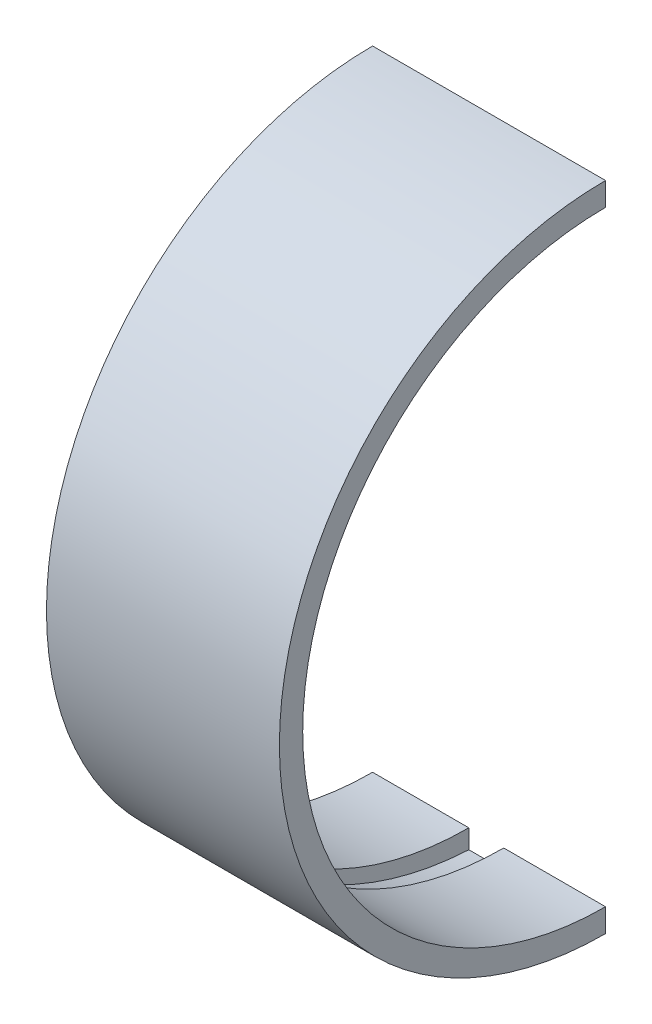
ISO-10303-21;
HEADER;
FILE_DESCRIPTION(('STEP AP214'),'2;1');
FILE_NAME('part.step','',(''),(''),'','','');
FILE_SCHEMA(('AUTOMOTIVE_DESIGN { 1 0 10303 214 1 1 1 1 }'));
ENDSEC;
DATA;
#1=APPLICATION_CONTEXT('core data for automotive mechanical design processes');
#2=APPLICATION_PROTOCOL_DEFINITION('international standard','automotive_design',2000,#1);
#3=PRODUCT_CONTEXT('',#1,'mechanical');
#4=PRODUCT('Part','Part','',(#3));
#5=PRODUCT_RELATED_PRODUCT_CATEGORY('part','',(#4));
#6=PRODUCT_DEFINITION_FORMATION('','',#4);
#7=PRODUCT_DEFINITION_CONTEXT('part definition',#1,'design');
#8=PRODUCT_DEFINITION('design','',#6,#7);
#9=PRODUCT_DEFINITION_SHAPE('','',#8);
#10=(LENGTH_UNIT() NAMED_UNIT(*) SI_UNIT(.MILLI.,.METRE.));
#11=(NAMED_UNIT(*) PLANE_ANGLE_UNIT() SI_UNIT($,.RADIAN.));
#12=(NAMED_UNIT(*) SI_UNIT($,.STERADIAN.) SOLID_ANGLE_UNIT());
#13=UNCERTAINTY_MEASURE_WITH_UNIT(LENGTH_MEASURE(1.E-05),#10,'distance_accuracy_value','');
#14=(GEOMETRIC_REPRESENTATION_CONTEXT(3) GLOBAL_UNCERTAINTY_ASSIGNED_CONTEXT((#13)) GLOBAL_UNIT_ASSIGNED_CONTEXT((#10,
#11,#12)) REPRESENTATION_CONTEXT('',''));
#15=CARTESIAN_POINT('',(0.,0.,0.));
#16=DIRECTION('',(0.,0.,1.));
#17=DIRECTION('',(1.,0.,0.));
#18=AXIS2_PLACEMENT_3D('',#15,#16,#17);
#19=CARTESIAN_POINT('',(508.,0.,0.));
#20=DIRECTION('',(-1.,0.,0.));
#21=DIRECTION('',(0.,0.,1.));
#22=AXIS2_PLACEMENT_3D('',#19,#20,#21);
#23=CYLINDRICAL_SURFACE('',#22,660.4);
#24=DIRECTION('',(-1.,0.,0.));
#25=VECTOR('',#24,1.);
#26=CARTESIAN_POINT('',(508.,660.4,0.));
#27=LINE('',#26,#25);
#28=CARTESIAN_POINT('',(209.868015847257,660.4,0.));
#29=VERTEX_POINT('',#28);
#30=CARTESIAN_POINT('',(0.,660.4,0.));
#31=VERTEX_POINT('',#30);
#32=EDGE_CURVE('E132',#29,#31,#27,.T.);
#33=ORIENTED_EDGE('',*,*,#32,.F.);
#34=CARTESIAN_POINT('',(209.868015847257,0.,0.));
#35=DIRECTION('',(1.,0.,0.));
#36=DIRECTION('',(0.,0.,-1.));
#37=AXIS2_PLACEMENT_3D('',#34,#35,#36);
#38=CIRCLE('',#37,660.4);
#39=CARTESIAN_POINT('',(209.868015847257,-660.4,-6.91732282851602E-12));
#40=VERTEX_POINT('',#39);
#41=EDGE_CURVE('E48',#29,#40,#38,.T.);
#42=ORIENTED_EDGE('',*,*,#41,.T.);
#43=DIRECTION('',(-1.,0.,0.));
#44=VECTOR('',#43,1.);
#45=CARTESIAN_POINT('',(508.,-660.4,-6.91732282851602E-12));
#46=LINE('',#45,#44);
#47=CARTESIAN_POINT('',(0.,-660.4,-6.91732282851602E-12));
#48=VERTEX_POINT('',#47);
#49=EDGE_CURVE('E129',#40,#48,#46,.T.);
#50=ORIENTED_EDGE('',*,*,#49,.T.);
#51=CARTESIAN_POINT('',(0.,0.,0.));
#52=DIRECTION('',(1.,0.,0.));
#53=DIRECTION('',(0.,0.,-1.));
#54=AXIS2_PLACEMENT_3D('',#51,#52,#53);
#55=CIRCLE('',#54,660.4);
#56=EDGE_CURVE('E138',#31,#48,#55,.T.);
#57=ORIENTED_EDGE('',*,*,#56,.F.);
#58=EDGE_LOOP('',(#33,#42,#50,#57));
#59=FACE_BOUND('',#58,.T.);
#60=ADVANCED_FACE('F33',(#59),#23,.F.);
#61=CARTESIAN_POINT('',(508.,0.,0.));
#62=DIRECTION('',(-1.,0.,0.));
#63=DIRECTION('',(0.,0.,1.));
#64=AXIS2_PLACEMENT_3D('',#61,#62,#63);
#65=CYLINDRICAL_SURFACE('',#64,711.2);
#66=CARTESIAN_POINT('',(0.,0.,0.));
#67=DIRECTION('',(1.,0.,0.));
#68=DIRECTION('',(0.,0.,-1.));
#69=AXIS2_PLACEMENT_3D('',#66,#67,#68);
#70=CIRCLE('',#69,711.2);
#71=CARTESIAN_POINT('',(0.,711.2,0.));
#72=VERTEX_POINT('',#71);
#73=CARTESIAN_POINT('',(0.,-711.2,-7.44942458455571E-12));
#74=VERTEX_POINT('',#73);
#75=EDGE_CURVE('E144',#72,#74,#70,.T.);
#76=ORIENTED_EDGE('',*,*,#75,.T.);
#77=DIRECTION('',(-1.,0.,0.));
#78=VECTOR('',#77,1.);
#79=CARTESIAN_POINT('',(508.,-711.2,-7.44942458455571E-12));
#80=LINE('',#79,#78);
#81=CARTESIAN_POINT('',(508.,-711.2,-7.44942458455571E-12));
#82=VERTEX_POINT('',#81);
#83=EDGE_CURVE('E111',#82,#74,#80,.T.);
#84=ORIENTED_EDGE('',*,*,#83,.F.);
#85=CARTESIAN_POINT('',(508.,0.,0.));
#86=DIRECTION('',(1.,0.,0.));
#87=DIRECTION('',(0.,0.,-1.));
#88=AXIS2_PLACEMENT_3D('',#85,#86,#87);
#89=CIRCLE('',#88,711.2);
#90=CARTESIAN_POINT('',(508.,711.2,0.));
#91=VERTEX_POINT('',#90);
#92=EDGE_CURVE('E83',#91,#82,#89,.T.);
#93=ORIENTED_EDGE('',*,*,#92,.F.);
#94=DIRECTION('',(-1.,0.,0.));
#95=VECTOR('',#94,1.);
#96=CARTESIAN_POINT('',(508.,711.2,0.));
#97=LINE('',#96,#95);
#98=EDGE_CURVE('E57',#91,#72,#97,.T.);
#99=ORIENTED_EDGE('',*,*,#98,.T.);
#100=EDGE_LOOP('',(#76,#84,#93,#99));
#101=FACE_BOUND('',#100,.T.);
#102=ADVANCED_FACE('F35',(#101),#65,.T.);
#103=CARTESIAN_POINT('',(508.,-660.4,-6.91732282851602E-12));
#104=DIRECTION('',(0.,0.,-1.));
#105=DIRECTION('',(0.,1.,0.));
#106=AXIS2_PLACEMENT_3D('',#103,#104,#105);
#107=PLANE('',#106);
#108=DIRECTION('',(0.,-1.,0.));
#109=VECTOR('',#108,1.);
#110=CARTESIAN_POINT('',(286.068015847257,-660.4,-6.91732282851602E-12));
#111=LINE('',#110,#109);
#112=CARTESIAN_POINT('',(286.068015847257,-660.4,-6.91732282851602E-12));
#113=VERTEX_POINT('',#112);
#114=CARTESIAN_POINT('',(286.068015847257,-701.842564308104,-7.35251524436174E-12));
#115=VERTEX_POINT('',#114);
#116=EDGE_CURVE('E155',#113,#115,#111,.T.);
#117=ORIENTED_EDGE('',*,*,#116,.F.);
#118=CARTESIAN_POINT('',(508.,-660.4,-6.91732282851602E-12));
#119=VERTEX_POINT('',#118);
#120=EDGE_CURVE('E126',#119,#113,#46,.T.);
#121=ORIENTED_EDGE('',*,*,#120,.F.);
#122=DIRECTION('',(0.,-1.,0.));
#123=VECTOR('',#122,1.);
#124=CARTESIAN_POINT('',(508.,-660.4,-6.91732282851602E-12));
#125=LINE('',#124,#123);
#126=EDGE_CURVE('E150',#119,#82,#125,.T.);
#127=ORIENTED_EDGE('',*,*,#126,.T.);
#128=ORIENTED_EDGE('',*,*,#83,.T.);
#129=DIRECTION('',(0.,-1.,0.));
#130=VECTOR('',#129,1.);
#131=CARTESIAN_POINT('',(0.,-660.4,-6.91732282851602E-12));
#132=LINE('',#131,#130);
#133=EDGE_CURVE('E141',#48,#74,#132,.T.);
#134=ORIENTED_EDGE('',*,*,#133,.F.);
#135=ORIENTED_EDGE('',*,*,#49,.F.);
#136=DIRECTION('',(0.,-1.,0.));
#137=VECTOR('',#136,1.);
#138=CARTESIAN_POINT('',(209.868015847257,-660.4,-6.91732282851602E-12));
#139=LINE('',#138,#137);
#140=CARTESIAN_POINT('',(209.868015847257,-701.842564308104,-7.35251524436174E-12));
#141=VERTEX_POINT('',#140);
#142=EDGE_CURVE('E159',#40,#141,#139,.T.);
#143=ORIENTED_EDGE('',*,*,#142,.T.);
#144=DIRECTION('',(-1.,0.,0.));
#145=VECTOR('',#144,1.);
#146=CARTESIAN_POINT('',(286.068015847257,-701.842564308104,-7.35251524436174E-12));
#147=LINE('',#146,#145);
#148=EDGE_CURVE('E118',#141,#115,#147,.F.);
#149=ORIENTED_EDGE('',*,*,#148,.T.);
#150=EDGE_LOOP('',(#117,#121,#127,#128,#134,#135,#143,#149));
#151=FACE_BOUND('',#150,.T.);
#152=ADVANCED_FACE('F165',(#151),#107,.T.);
#153=CARTESIAN_POINT('',(286.068015847257,0.,0.));
#154=DIRECTION('',(1.,0.,0.));
#155=DIRECTION('',(0.,0.,-1.));
#156=AXIS2_PLACEMENT_3D('',#153,#154,#155);
#157=CIRCLE('',#156,660.4);
#158=CARTESIAN_POINT('',(286.068015847257,660.4,0.));
#159=VERTEX_POINT('',#158);
#160=EDGE_CURVE('E157',#159,#113,#157,.T.);
#161=ORIENTED_EDGE('',*,*,#160,.F.);
#162=CARTESIAN_POINT('',(508.,660.4,0.));
#163=VERTEX_POINT('',#162);
#164=EDGE_CURVE('E130',#163,#159,#27,.T.);
#165=ORIENTED_EDGE('',*,*,#164,.F.);
#166=CARTESIAN_POINT('',(508.,0.,0.));
#167=DIRECTION('',(1.,0.,0.));
#168=DIRECTION('',(0.,0.,-1.));
#169=AXIS2_PLACEMENT_3D('',#166,#167,#168);
#170=CIRCLE('',#169,660.4);
#171=EDGE_CURVE('E147',#163,#119,#170,.T.);
#172=ORIENTED_EDGE('',*,*,#171,.T.);
#173=ORIENTED_EDGE('',*,*,#120,.T.);
#174=EDGE_LOOP('',(#161,#165,#172,#173));
#175=FACE_BOUND('',#174,.T.);
#176=ADVANCED_FACE('F176',(#175),#23,.F.);
#177=CARTESIAN_POINT('',(508.,711.2,0.));
#178=DIRECTION('',(0.,0.,-1.));
#179=DIRECTION('',(0.,1.,0.));
#180=AXIS2_PLACEMENT_3D('',#177,#178,#179);
#181=PLANE('',#180);
#182=DIRECTION('',(0.,-1.,0.));
#183=VECTOR('',#182,1.);
#184=CARTESIAN_POINT('',(286.068015847257,711.2,0.));
#185=LINE('',#184,#183);
#186=CARTESIAN_POINT('',(286.068015847257,706.028233309,0.));
#187=VERTEX_POINT('',#186);
#188=EDGE_CURVE('E11',#187,#159,#185,.T.);
#189=ORIENTED_EDGE('',*,*,#188,.F.);
#190=DIRECTION('',(-1.,0.,0.));
#191=VECTOR('',#190,1.);
#192=CARTESIAN_POINT('',(286.068015847257,706.028233309,0.));
#193=LINE('',#192,#191);
#194=CARTESIAN_POINT('',(209.868015847257,706.028233309,0.));
#195=VERTEX_POINT('',#194);
#196=EDGE_CURVE('E41',#187,#195,#193,.T.);
#197=ORIENTED_EDGE('',*,*,#196,.T.);
#198=DIRECTION('',(0.,-1.,0.));
#199=VECTOR('',#198,1.);
#200=CARTESIAN_POINT('',(209.868015847257,711.2,0.));
#201=LINE('',#200,#199);
#202=EDGE_CURVE('E104',#195,#29,#201,.T.);
#203=ORIENTED_EDGE('',*,*,#202,.T.);
#204=ORIENTED_EDGE('',*,*,#32,.T.);
#205=DIRECTION('',(0.,-1.,0.));
#206=VECTOR('',#205,1.);
#207=CARTESIAN_POINT('',(0.,711.2,0.));
#208=LINE('',#207,#206);
#209=EDGE_CURVE('E135',#72,#31,#208,.T.);
#210=ORIENTED_EDGE('',*,*,#209,.F.);
#211=ORIENTED_EDGE('',*,*,#98,.F.);
#212=DIRECTION('',(0.,-1.,0.));
#213=VECTOR('',#212,1.);
#214=CARTESIAN_POINT('',(508.,711.2,0.));
#215=LINE('',#214,#213);
#216=EDGE_CURVE('E134',#91,#163,#215,.T.);
#217=ORIENTED_EDGE('',*,*,#216,.T.);
#218=ORIENTED_EDGE('',*,*,#164,.T.);
#219=EDGE_LOOP('',(#189,#197,#203,#204,#210,#211,#217,#218));
#220=FACE_BOUND('',#219,.T.);
#221=ADVANCED_FACE('F122',(#220),#181,.T.);
#222=CARTESIAN_POINT('',(508.,0.,0.));
#223=DIRECTION('',(1.,0.,0.));
#224=DIRECTION('',(0.,0.,-1.));
#225=AXIS2_PLACEMENT_3D('',#222,#223,#224);
#226=PLANE('',#225);
#227=ORIENTED_EDGE('',*,*,#92,.T.);
#228=ORIENTED_EDGE('',*,*,#126,.F.);
#229=ORIENTED_EDGE('',*,*,#171,.F.);
#230=ORIENTED_EDGE('',*,*,#216,.F.);
#231=EDGE_LOOP('',(#227,#228,#229,#230));
#232=FACE_BOUND('',#231,.T.);
#233=ADVANCED_FACE('F173',(#232),#226,.T.);
#234=CARTESIAN_POINT('',(0.,0.,0.));
#235=DIRECTION('',(1.,0.,0.));
#236=DIRECTION('',(0.,0.,-1.));
#237=AXIS2_PLACEMENT_3D('',#234,#235,#236);
#238=PLANE('',#237);
#239=ORIENTED_EDGE('',*,*,#75,.F.);
#240=ORIENTED_EDGE('',*,*,#209,.T.);
#241=ORIENTED_EDGE('',*,*,#56,.T.);
#242=ORIENTED_EDGE('',*,*,#133,.T.);
#243=EDGE_LOOP('',(#239,#240,#241,#242));
#244=FACE_BOUND('',#243,.T.);
#245=ADVANCED_FACE('F171',(#244),#238,.F.);
#246=CARTESIAN_POINT('',(286.068015847257,2.09283450044803,-35.895359090632));
#247=DIRECTION('',(-1.,0.,0.));
#248=DIRECTION('',(0.,0.,1.));
#249=AXIS2_PLACEMENT_3D('',#246,#247,#248);
#250=CYLINDRICAL_SURFACE('',#249,704.85);
#251=CARTESIAN_POINT('',(209.868015847257,2.09283450044803,-35.895359090632));
#252=DIRECTION('',(1.,0.,0.));
#253=DIRECTION('',(0.,0.,-1.));
#254=AXIS2_PLACEMENT_3D('',#251,#252,#253);
#255=CIRCLE('',#254,704.85);
#256=EDGE_CURVE('E107',#195,#141,#255,.T.);
#257=ORIENTED_EDGE('',*,*,#256,.F.);
#258=ORIENTED_EDGE('',*,*,#196,.F.);
#259=CARTESIAN_POINT('',(286.068015847257,2.09283450044803,-35.895359090632));
#260=DIRECTION('',(1.,0.,0.));
#261=DIRECTION('',(0.,0.,-1.));
#262=AXIS2_PLACEMENT_3D('',#259,#260,#261);
#263=CIRCLE('',#262,704.85);
#264=EDGE_CURVE('E119',#187,#115,#263,.T.);
#265=ORIENTED_EDGE('',*,*,#264,.T.);
#266=ORIENTED_EDGE('',*,*,#148,.F.);
#267=EDGE_LOOP('',(#257,#258,#265,#266));
#268=FACE_BOUND('',#267,.T.);
#269=ADVANCED_FACE('F114',(#268),#250,.F.);
#270=CARTESIAN_POINT('',(286.068015847257,2.09283450044803,-35.895359090632));
#271=DIRECTION('',(1.,0.,0.));
#272=DIRECTION('',(0.,0.,-1.));
#273=AXIS2_PLACEMENT_3D('',#270,#271,#272);
#274=PLANE('',#273);
#275=ORIENTED_EDGE('',*,*,#116,.T.);
#276=ORIENTED_EDGE('',*,*,#264,.F.);
#277=ORIENTED_EDGE('',*,*,#188,.T.);
#278=ORIENTED_EDGE('',*,*,#160,.T.);
#279=EDGE_LOOP('',(#275,#276,#277,#278));
#280=FACE_BOUND('',#279,.T.);
#281=ADVANCED_FACE('F177',(#280),#274,.F.);
#282=CARTESIAN_POINT('',(209.868015847257,2.09283450044803,-35.895359090632));
#283=DIRECTION('',(1.,0.,0.));
#284=DIRECTION('',(0.,0.,-1.));
#285=AXIS2_PLACEMENT_3D('',#282,#283,#284);
#286=PLANE('',#285);
#287=ORIENTED_EDGE('',*,*,#41,.F.);
#288=ORIENTED_EDGE('',*,*,#202,.F.);
#289=ORIENTED_EDGE('',*,*,#256,.T.);
#290=ORIENTED_EDGE('',*,*,#142,.F.);
#291=EDGE_LOOP('',(#287,#288,#289,#290));
#292=FACE_BOUND('',#291,.T.);
#293=ADVANCED_FACE('F106',(#292),#286,.T.);
#294=CLOSED_SHELL('',(#60,#102,#152,#176,#221,#233,#245,#269,#281,#293));
#295=MANIFOLD_SOLID_BREP('B2',#294);
#296=ADVANCED_BREP_SHAPE_REPRESENTATION('',(#18,#295),#14);
#297=SHAPE_DEFINITION_REPRESENTATION(#9,#296);
ENDSEC;
END-ISO-10303-21;
